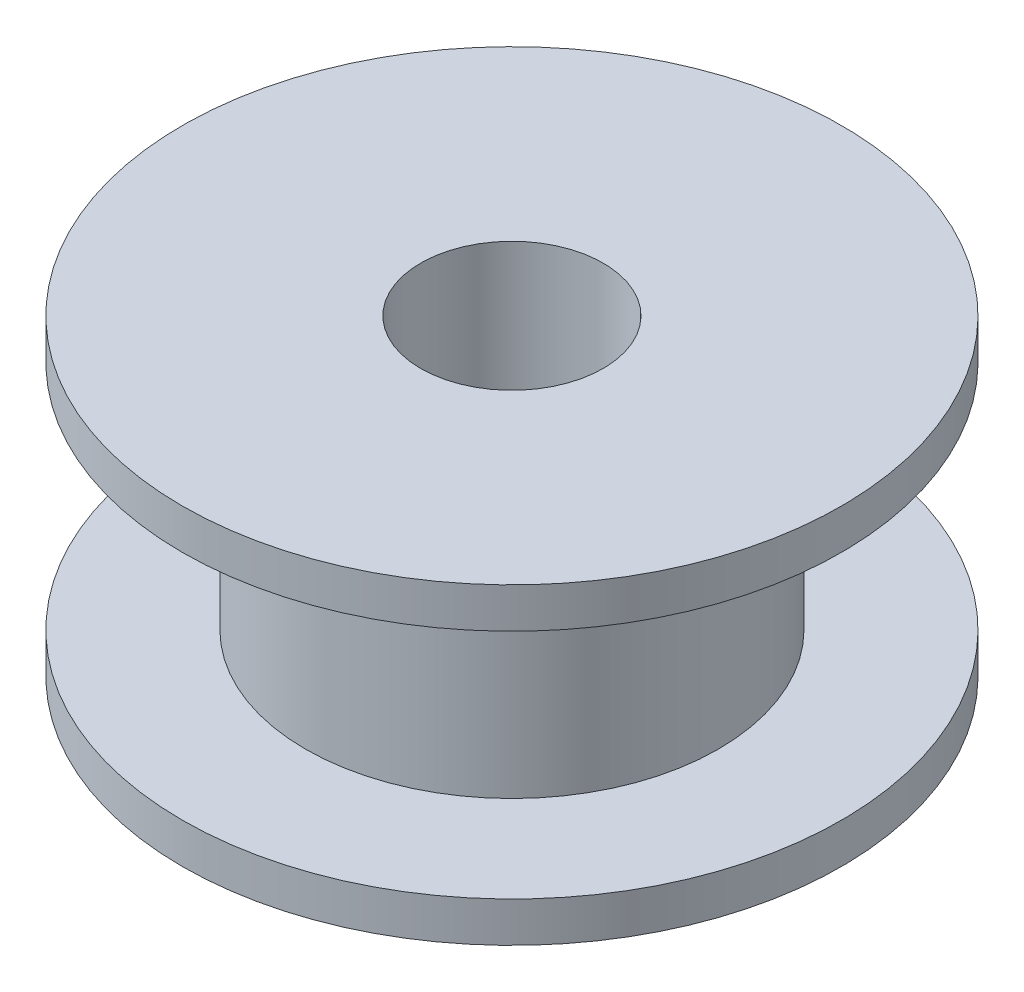
ISO-10303-21;
HEADER;
FILE_DESCRIPTION(('STEP AP214'),'2;1');
FILE_NAME('part.step','',(''),(''),'','','');
FILE_SCHEMA(('AUTOMOTIVE_DESIGN { 1 0 10303 214 1 1 1 1 }'));
ENDSEC;
DATA;
#1=APPLICATION_CONTEXT('core data for automotive mechanical design processes');
#2=APPLICATION_PROTOCOL_DEFINITION('international standard','automotive_design',2000,#1);
#3=PRODUCT_CONTEXT('',#1,'mechanical');
#4=PRODUCT('Part','Part','',(#3));
#5=PRODUCT_RELATED_PRODUCT_CATEGORY('part','',(#4));
#6=PRODUCT_DEFINITION_FORMATION('','',#4);
#7=PRODUCT_DEFINITION_CONTEXT('part definition',#1,'design');
#8=PRODUCT_DEFINITION('design','',#6,#7);
#9=PRODUCT_DEFINITION_SHAPE('','',#8);
#10=(LENGTH_UNIT() NAMED_UNIT(*) SI_UNIT(.MILLI.,.METRE.));
#11=(NAMED_UNIT(*) PLANE_ANGLE_UNIT() SI_UNIT($,.RADIAN.));
#12=(NAMED_UNIT(*) SI_UNIT($,.STERADIAN.) SOLID_ANGLE_UNIT());
#13=UNCERTAINTY_MEASURE_WITH_UNIT(LENGTH_MEASURE(1.E-05),#10,'distance_accuracy_value','');
#14=(GEOMETRIC_REPRESENTATION_CONTEXT(3) GLOBAL_UNCERTAINTY_ASSIGNED_CONTEXT((#13)) GLOBAL_UNIT_ASSIGNED_CONTEXT((#10,
#11,#12)) REPRESENTATION_CONTEXT('',''));
#15=CARTESIAN_POINT('',(0.,0.,0.));
#16=DIRECTION('',(0.,0.,1.));
#17=DIRECTION('',(1.,0.,0.));
#18=AXIS2_PLACEMENT_3D('',#15,#16,#17);
#19=CARTESIAN_POINT('',(0.,6.35,0.));
#20=DIRECTION('',(0.,-1.,0.));
#21=DIRECTION('',(0.,0.,-1.));
#22=AXIS2_PLACEMENT_3D('',#19,#20,#21);
#23=CYLINDRICAL_SURFACE('',#22,5.655);
#24=CARTESIAN_POINT('',(0.,6.35,0.));
#25=DIRECTION('',(0.,1.,0.));
#26=DIRECTION('',(0.,0.,1.));
#27=AXIS2_PLACEMENT_3D('',#24,#25,#26);
#28=CIRCLE('',#27,5.655);
#29=CARTESIAN_POINT('',(0.,6.35,5.655));
#30=VERTEX_POINT('',#29);
#31=EDGE_CURVE('E10',#30,#30,#28,.T.);
#32=ORIENTED_EDGE('',*,*,#31,.F.);
#33=EDGE_LOOP('',(#32));
#34=FACE_BOUND('',#33,.T.);
#35=CARTESIAN_POINT('',(0.,0.,0.));
#36=DIRECTION('',(0.,1.,0.));
#37=DIRECTION('',(0.,0.,1.));
#38=AXIS2_PLACEMENT_3D('',#35,#36,#37);
#39=CIRCLE('',#38,5.655);
#40=CARTESIAN_POINT('',(0.,0.,5.655));
#41=VERTEX_POINT('',#40);
#42=EDGE_CURVE('E38',#41,#41,#39,.T.);
#43=ORIENTED_EDGE('',*,*,#42,.T.);
#44=EDGE_LOOP('',(#43));
#45=FACE_BOUND('',#44,.T.);
#46=ADVANCED_FACE('F32',(#34,#45),#23,.T.);
#47=CARTESIAN_POINT('',(0.,-1.1,0.));
#48=DIRECTION('',(0.,1.,0.));
#49=DIRECTION('',(0.,0.,1.));
#50=AXIS2_PLACEMENT_3D('',#47,#48,#49);
#51=CYLINDRICAL_SURFACE('',#50,9.025);
#52=CARTESIAN_POINT('',(0.,-1.1,0.));
#53=DIRECTION('',(0.,1.,0.));
#54=DIRECTION('',(0.,0.,1.));
#55=AXIS2_PLACEMENT_3D('',#52,#53,#54);
#56=CIRCLE('',#55,9.025);
#57=CARTESIAN_POINT('',(0.,-1.1,9.025));
#58=VERTEX_POINT('',#57);
#59=EDGE_CURVE('E42',#58,#58,#56,.T.);
#60=ORIENTED_EDGE('',*,*,#59,.T.);
#61=EDGE_LOOP('',(#60));
#62=FACE_BOUND('',#61,.T.);
#63=CARTESIAN_POINT('',(0.,0.,0.));
#64=DIRECTION('',(0.,1.,0.));
#65=DIRECTION('',(0.,0.,1.));
#66=AXIS2_PLACEMENT_3D('',#63,#64,#65);
#67=CIRCLE('',#66,9.025);
#68=CARTESIAN_POINT('',(0.,0.,9.025));
#69=VERTEX_POINT('',#68);
#70=EDGE_CURVE('E46',#69,#69,#67,.T.);
#71=ORIENTED_EDGE('',*,*,#70,.F.);
#72=EDGE_LOOP('',(#71));
#73=FACE_BOUND('',#72,.T.);
#74=ADVANCED_FACE('F88',(#62,#73),#51,.T.);
#75=CARTESIAN_POINT('',(0.,-1.1,0.));
#76=DIRECTION('',(0.,1.,0.));
#77=DIRECTION('',(0.,0.,1.));
#78=AXIS2_PLACEMENT_3D('',#75,#76,#77);
#79=PLANE('',#78);
#80=CARTESIAN_POINT('',(0.,-1.1,0.));
#81=DIRECTION('',(0.,1.,0.));
#82=DIRECTION('',(0.,0.,1.));
#83=AXIS2_PLACEMENT_3D('',#80,#81,#82);
#84=CIRCLE('',#83,2.5);
#85=CARTESIAN_POINT('',(0.,-1.1,2.5));
#86=VERTEX_POINT('',#85);
#87=EDGE_CURVE('E55',#86,#86,#84,.F.);
#88=ORIENTED_EDGE('',*,*,#87,.F.);
#89=EDGE_LOOP('',(#88));
#90=FACE_BOUND('',#89,.T.);
#91=ORIENTED_EDGE('',*,*,#59,.F.);
#92=EDGE_LOOP('',(#91));
#93=FACE_BOUND('',#92,.T.);
#94=ADVANCED_FACE('F93',(#90,#93),#79,.F.);
#95=CARTESIAN_POINT('',(0.,0.,0.));
#96=DIRECTION('',(0.,1.,0.));
#97=DIRECTION('',(0.,0.,1.));
#98=AXIS2_PLACEMENT_3D('',#95,#96,#97);
#99=PLANE('',#98);
#100=ORIENTED_EDGE('',*,*,#42,.F.);
#101=EDGE_LOOP('',(#100));
#102=FACE_BOUND('',#101,.T.);
#103=ORIENTED_EDGE('',*,*,#70,.T.);
#104=EDGE_LOOP('',(#103));
#105=FACE_BOUND('',#104,.T.);
#106=ADVANCED_FACE('F77',(#102,#105),#99,.T.);
#107=CARTESIAN_POINT('',(0.,7.45,0.));
#108=DIRECTION('',(0.,-1.,0.));
#109=DIRECTION('',(0.,0.,-1.));
#110=AXIS2_PLACEMENT_3D('',#107,#108,#109);
#111=CYLINDRICAL_SURFACE('',#110,9.025);
#112=CARTESIAN_POINT('',(0.,7.45,0.));
#113=DIRECTION('',(0.,1.,0.));
#114=DIRECTION('',(0.,0.,1.));
#115=AXIS2_PLACEMENT_3D('',#112,#113,#114);
#116=CIRCLE('',#115,9.025);
#117=CARTESIAN_POINT('',(0.,7.45,9.025));
#118=VERTEX_POINT('',#117);
#119=EDGE_CURVE('E50',#118,#118,#116,.T.);
#120=ORIENTED_EDGE('',*,*,#119,.F.);
#121=EDGE_LOOP('',(#120));
#122=FACE_BOUND('',#121,.T.);
#123=CARTESIAN_POINT('',(0.,6.35,0.));
#124=DIRECTION('',(0.,1.,0.));
#125=DIRECTION('',(0.,0.,1.));
#126=AXIS2_PLACEMENT_3D('',#123,#124,#125);
#127=CIRCLE('',#126,9.025);
#128=CARTESIAN_POINT('',(0.,6.35,9.025));
#129=VERTEX_POINT('',#128);
#130=EDGE_CURVE('E52',#129,#129,#127,.T.);
#131=ORIENTED_EDGE('',*,*,#130,.T.);
#132=EDGE_LOOP('',(#131));
#133=FACE_BOUND('',#132,.T.);
#134=ADVANCED_FACE('F71',(#122,#133),#111,.T.);
#135=CARTESIAN_POINT('',(0.,7.45,0.));
#136=DIRECTION('',(0.,1.,0.));
#137=DIRECTION('',(0.,0.,1.));
#138=AXIS2_PLACEMENT_3D('',#135,#136,#137);
#139=PLANE('',#138);
#140=CARTESIAN_POINT('',(0.,7.45,0.));
#141=DIRECTION('',(0.,1.,0.));
#142=DIRECTION('',(0.,0.,1.));
#143=AXIS2_PLACEMENT_3D('',#140,#141,#142);
#144=CIRCLE('',#143,2.5);
#145=CARTESIAN_POINT('',(0.,7.45,2.5));
#146=VERTEX_POINT('',#145);
#147=EDGE_CURVE('E60',#146,#146,#144,.T.);
#148=ORIENTED_EDGE('',*,*,#147,.F.);
#149=EDGE_LOOP('',(#148));
#150=FACE_BOUND('',#149,.T.);
#151=ORIENTED_EDGE('',*,*,#119,.T.);
#152=EDGE_LOOP('',(#151));
#153=FACE_BOUND('',#152,.T.);
#154=ADVANCED_FACE('F67',(#150,#153),#139,.T.);
#155=CARTESIAN_POINT('',(0.,6.35,0.));
#156=DIRECTION('',(0.,1.,0.));
#157=DIRECTION('',(0.,0.,1.));
#158=AXIS2_PLACEMENT_3D('',#155,#156,#157);
#159=PLANE('',#158);
#160=ORIENTED_EDGE('',*,*,#31,.T.);
#161=EDGE_LOOP('',(#160));
#162=FACE_BOUND('',#161,.T.);
#163=ORIENTED_EDGE('',*,*,#130,.F.);
#164=EDGE_LOOP('',(#163));
#165=FACE_BOUND('',#164,.T.);
#166=ADVANCED_FACE('F70',(#162,#165),#159,.F.);
#167=CARTESIAN_POINT('',(0.,-1.101,0.));
#168=DIRECTION('',(0.,1.,0.));
#169=DIRECTION('',(0.,0.,1.));
#170=AXIS2_PLACEMENT_3D('',#167,#168,#169);
#171=CYLINDRICAL_SURFACE('',#170,2.5);
#172=ORIENTED_EDGE('',*,*,#147,.T.);
#173=EDGE_LOOP('',(#172));
#174=FACE_BOUND('',#173,.T.);
#175=ORIENTED_EDGE('',*,*,#87,.T.);
#176=EDGE_LOOP('',(#175));
#177=FACE_BOUND('',#176,.T.);
#178=ADVANCED_FACE('F64',(#174,#177),#171,.F.);
#179=CLOSED_SHELL('',(#46,#74,#94,#106,#134,#154,#166,#178));
#180=MANIFOLD_SOLID_BREP('B2',#179);
#181=ADVANCED_BREP_SHAPE_REPRESENTATION('',(#18,#180),#14);
#182=SHAPE_DEFINITION_REPRESENTATION(#9,#181);
ENDSEC;
END-ISO-10303-21;
